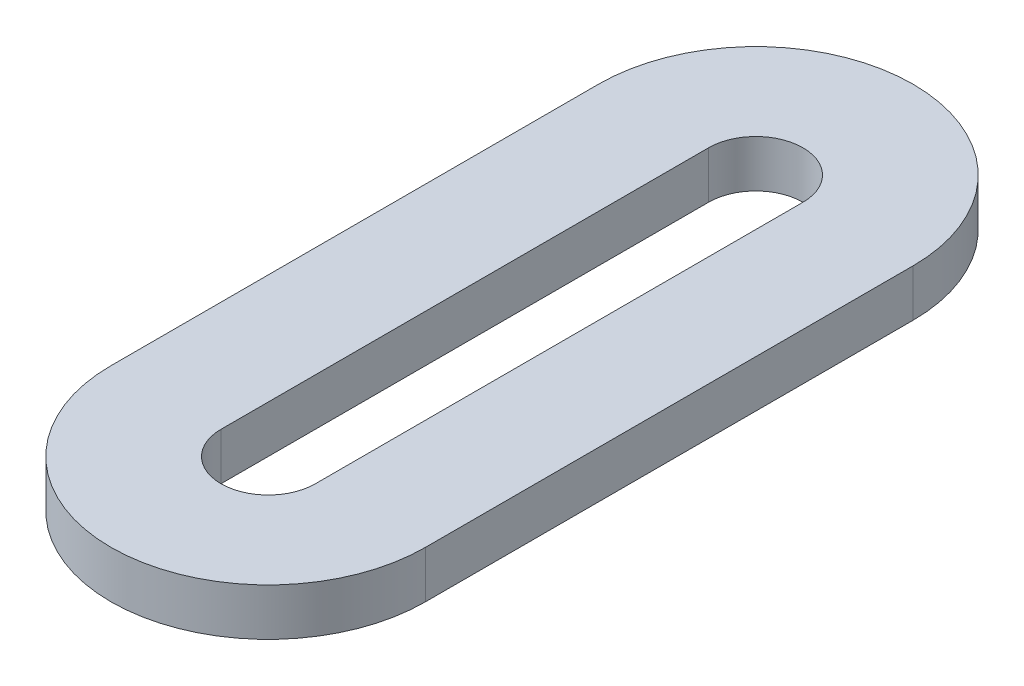
ISO-10303-21;
HEADER;
FILE_DESCRIPTION(('STEP AP214'),'2;1');
FILE_NAME('part.step','',(''),(''),'','','');
FILE_SCHEMA(('AUTOMOTIVE_DESIGN { 1 0 10303 214 1 1 1 1 }'));
ENDSEC;
DATA;
#1=APPLICATION_CONTEXT('core data for automotive mechanical design processes');
#2=APPLICATION_PROTOCOL_DEFINITION('international standard','automotive_design',2000,#1);
#3=PRODUCT_CONTEXT('',#1,'mechanical');
#4=PRODUCT('Part','Part','',(#3));
#5=PRODUCT_RELATED_PRODUCT_CATEGORY('part','',(#4));
#6=PRODUCT_DEFINITION_FORMATION('','',#4);
#7=PRODUCT_DEFINITION_CONTEXT('part definition',#1,'design');
#8=PRODUCT_DEFINITION('design','',#6,#7);
#9=PRODUCT_DEFINITION_SHAPE('','',#8);
#10=(LENGTH_UNIT() NAMED_UNIT(*) SI_UNIT(.MILLI.,.METRE.));
#11=(NAMED_UNIT(*) PLANE_ANGLE_UNIT() SI_UNIT($,.RADIAN.));
#12=(NAMED_UNIT(*) SI_UNIT($,.STERADIAN.) SOLID_ANGLE_UNIT());
#13=UNCERTAINTY_MEASURE_WITH_UNIT(LENGTH_MEASURE(1.E-05),#10,'distance_accuracy_value','');
#14=(GEOMETRIC_REPRESENTATION_CONTEXT(3) GLOBAL_UNCERTAINTY_ASSIGNED_CONTEXT((#13)) GLOBAL_UNIT_ASSIGNED_CONTEXT((#10,
#11,#12)) REPRESENTATION_CONTEXT('',''));
#15=CARTESIAN_POINT('',(0.,0.,0.));
#16=DIRECTION('',(0.,0.,1.));
#17=DIRECTION('',(1.,0.,0.));
#18=AXIS2_PLACEMENT_3D('',#15,#16,#17);
#19=CARTESIAN_POINT('',(0.,3.,-31.));
#20=DIRECTION('',(0.,1.,0.));
#21=DIRECTION('',(0.,0.,1.));
#22=AXIS2_PLACEMENT_3D('',#19,#20,#21);
#23=PLANE('',#22);
#24=CARTESIAN_POINT('',(0.,3.,-31.));
#25=DIRECTION('',(0.,1.,0.));
#26=DIRECTION('',(0.,0.,1.));
#27=AXIS2_PLACEMENT_3D('',#24,#25,#26);
#28=CIRCLE('',#27,9.99999999999999);
#29=CARTESIAN_POINT('',(9.99999999999999,3.,-31.));
#30=VERTEX_POINT('',#29);
#31=CARTESIAN_POINT('',(-9.99999999999999,3.,-31.));
#32=VERTEX_POINT('',#31);
#33=EDGE_CURVE('E133',#30,#32,#28,.T.);
#34=ORIENTED_EDGE('',*,*,#33,.T.);
#35=DIRECTION('',(0.,0.,1.));
#36=VECTOR('',#35,1.);
#37=CARTESIAN_POINT('',(-9.99999999999999,3.,-31.));
#38=LINE('',#37,#36);
#39=CARTESIAN_POINT('',(-9.99999999999999,3.,0.));
#40=VERTEX_POINT('',#39);
#41=EDGE_CURVE('E136',#32,#40,#38,.T.);
#42=ORIENTED_EDGE('',*,*,#41,.T.);
#43=CARTESIAN_POINT('',(0.,3.,0.));
#44=DIRECTION('',(0.,1.,0.));
#45=DIRECTION('',(0.,0.,1.));
#46=AXIS2_PLACEMENT_3D('',#43,#44,#45);
#47=CIRCLE('',#46,9.99999999999999);
#48=CARTESIAN_POINT('',(9.99999999999999,3.,0.));
#49=VERTEX_POINT('',#48);
#50=EDGE_CURVE('E139',#40,#49,#47,.T.);
#51=ORIENTED_EDGE('',*,*,#50,.T.);
#52=DIRECTION('',(0.,0.,-1.));
#53=VECTOR('',#52,1.);
#54=CARTESIAN_POINT('',(9.99999999999999,3.,-31.));
#55=LINE('',#54,#53);
#56=EDGE_CURVE('E141',#49,#30,#55,.T.);
#57=ORIENTED_EDGE('',*,*,#56,.T.);
#58=EDGE_LOOP('',(#34,#42,#51,#57));
#59=FACE_BOUND('',#58,.T.);
#60=DIRECTION('',(0.,0.,-1.));
#61=VECTOR('',#60,1.);
#62=CARTESIAN_POINT('',(2.99999999999999,3.,0.));
#63=LINE('',#62,#61);
#64=CARTESIAN_POINT('',(2.99999999999999,3.,0.));
#65=VERTEX_POINT('',#64);
#66=CARTESIAN_POINT('',(2.99999999999999,3.,-31.));
#67=VERTEX_POINT('',#66);
#68=EDGE_CURVE('E105',#65,#67,#63,.T.);
#69=ORIENTED_EDGE('',*,*,#68,.F.);
#70=CARTESIAN_POINT('',(0.,3.,0.));
#71=DIRECTION('',(0.,1.,0.));
#72=DIRECTION('',(0.,0.,1.));
#73=AXIS2_PLACEMENT_3D('',#70,#71,#72);
#74=CIRCLE('',#73,2.99999999999999);
#75=CARTESIAN_POINT('',(-2.99999999999999,3.,0.));
#76=VERTEX_POINT('',#75);
#77=EDGE_CURVE('E97',#76,#65,#74,.T.);
#78=ORIENTED_EDGE('',*,*,#77,.F.);
#79=DIRECTION('',(0.,0.,1.));
#80=VECTOR('',#79,1.);
#81=CARTESIAN_POINT('',(-2.99999999999999,3.,0.));
#82=LINE('',#81,#80);
#83=CARTESIAN_POINT('',(-2.99999999999999,3.,-31.));
#84=VERTEX_POINT('',#83);
#85=EDGE_CURVE('E119',#84,#76,#82,.T.);
#86=ORIENTED_EDGE('',*,*,#85,.F.);
#87=CARTESIAN_POINT('',(0.,3.,-31.));
#88=DIRECTION('',(0.,1.,0.));
#89=DIRECTION('',(0.,0.,1.));
#90=AXIS2_PLACEMENT_3D('',#87,#88,#89);
#91=CIRCLE('',#90,2.99999999999999);
#92=EDGE_CURVE('E117',#67,#84,#91,.T.);
#93=ORIENTED_EDGE('',*,*,#92,.F.);
#94=EDGE_LOOP('',(#69,#78,#86,#93));
#95=FACE_BOUND('',#94,.T.);
#96=ADVANCED_FACE('F32',(#59,#95),#23,.T.);
#97=CARTESIAN_POINT('',(0.,0.,-31.));
#98=DIRECTION('',(0.,1.,0.));
#99=DIRECTION('',(0.,0.,1.));
#100=AXIS2_PLACEMENT_3D('',#97,#98,#99);
#101=PLANE('',#100);
#102=CARTESIAN_POINT('',(0.,0.,-31.));
#103=DIRECTION('',(0.,1.,0.));
#104=DIRECTION('',(0.,0.,1.));
#105=AXIS2_PLACEMENT_3D('',#102,#103,#104);
#106=CIRCLE('',#105,9.99999999999999);
#107=CARTESIAN_POINT('',(9.99999999999999,0.,-31.));
#108=VERTEX_POINT('',#107);
#109=CARTESIAN_POINT('',(-9.99999999999999,0.,-31.));
#110=VERTEX_POINT('',#109);
#111=EDGE_CURVE('E113',#108,#110,#106,.T.);
#112=ORIENTED_EDGE('',*,*,#111,.F.);
#113=DIRECTION('',(0.,0.,-1.));
#114=VECTOR('',#113,1.);
#115=CARTESIAN_POINT('',(9.99999999999999,0.,-31.));
#116=LINE('',#115,#114);
#117=CARTESIAN_POINT('',(9.99999999999999,0.,0.));
#118=VERTEX_POINT('',#117);
#119=EDGE_CURVE('E137',#118,#108,#116,.T.);
#120=ORIENTED_EDGE('',*,*,#119,.F.);
#121=CARTESIAN_POINT('',(0.,0.,0.));
#122=DIRECTION('',(0.,1.,0.));
#123=DIRECTION('',(0.,0.,1.));
#124=AXIS2_PLACEMENT_3D('',#121,#122,#123);
#125=CIRCLE('',#124,9.99999999999999);
#126=CARTESIAN_POINT('',(-9.99999999999999,0.,0.));
#127=VERTEX_POINT('',#126);
#128=EDGE_CURVE('E148',#127,#118,#125,.T.);
#129=ORIENTED_EDGE('',*,*,#128,.F.);
#130=DIRECTION('',(0.,0.,1.));
#131=VECTOR('',#130,1.);
#132=CARTESIAN_POINT('',(-9.99999999999999,0.,-31.));
#133=LINE('',#132,#131);
#134=EDGE_CURVE('E146',#110,#127,#133,.T.);
#135=ORIENTED_EDGE('',*,*,#134,.F.);
#136=EDGE_LOOP('',(#112,#120,#129,#135));
#137=FACE_BOUND('',#136,.T.);
#138=CARTESIAN_POINT('',(0.,0.,0.));
#139=DIRECTION('',(0.,1.,0.));
#140=DIRECTION('',(0.,0.,1.));
#141=AXIS2_PLACEMENT_3D('',#138,#139,#140);
#142=CIRCLE('',#141,2.99999999999999);
#143=CARTESIAN_POINT('',(-2.99999999999999,0.,0.));
#144=VERTEX_POINT('',#143);
#145=CARTESIAN_POINT('',(2.99999999999999,0.,0.));
#146=VERTEX_POINT('',#145);
#147=EDGE_CURVE('E55',#144,#146,#142,.T.);
#148=ORIENTED_EDGE('',*,*,#147,.T.);
#149=DIRECTION('',(0.,0.,-1.));
#150=VECTOR('',#149,1.);
#151=CARTESIAN_POINT('',(2.99999999999999,0.,0.));
#152=LINE('',#151,#150);
#153=CARTESIAN_POINT('',(2.99999999999999,0.,-31.));
#154=VERTEX_POINT('',#153);
#155=EDGE_CURVE('E112',#146,#154,#152,.T.);
#156=ORIENTED_EDGE('',*,*,#155,.T.);
#157=CARTESIAN_POINT('',(0.,0.,-31.));
#158=DIRECTION('',(0.,1.,0.));
#159=DIRECTION('',(0.,0.,1.));
#160=AXIS2_PLACEMENT_3D('',#157,#158,#159);
#161=CIRCLE('',#160,2.99999999999999);
#162=CARTESIAN_POINT('',(-2.99999999999999,0.,-31.));
#163=VERTEX_POINT('',#162);
#164=EDGE_CURVE('E125',#154,#163,#161,.T.);
#165=ORIENTED_EDGE('',*,*,#164,.T.);
#166=DIRECTION('',(0.,0.,1.));
#167=VECTOR('',#166,1.);
#168=CARTESIAN_POINT('',(-2.99999999999999,0.,0.));
#169=LINE('',#168,#167);
#170=EDGE_CURVE('E106',#163,#144,#169,.T.);
#171=ORIENTED_EDGE('',*,*,#170,.T.);
#172=EDGE_LOOP('',(#148,#156,#165,#171));
#173=FACE_BOUND('',#172,.T.);
#174=ADVANCED_FACE('F166',(#137,#173),#101,.F.);
#175=CARTESIAN_POINT('',(0.,3.,-31.));
#176=DIRECTION('',(0.,-1.,0.));
#177=DIRECTION('',(0.,0.,-1.));
#178=AXIS2_PLACEMENT_3D('',#175,#176,#177);
#179=CYLINDRICAL_SURFACE('',#178,9.99999999999999);
#180=ORIENTED_EDGE('',*,*,#111,.T.);
#181=DIRECTION('',(0.,-1.,0.));
#182=VECTOR('',#181,1.);
#183=CARTESIAN_POINT('',(-9.99999999999999,3.,-31.));
#184=LINE('',#183,#182);
#185=EDGE_CURVE('E11',#32,#110,#184,.T.);
#186=ORIENTED_EDGE('',*,*,#185,.F.);
#187=ORIENTED_EDGE('',*,*,#33,.F.);
#188=DIRECTION('',(0.,-1.,0.));
#189=VECTOR('',#188,1.);
#190=CARTESIAN_POINT('',(9.99999999999999,3.,-31.));
#191=LINE('',#190,#189);
#192=EDGE_CURVE('E143',#30,#108,#191,.T.);
#193=ORIENTED_EDGE('',*,*,#192,.T.);
#194=EDGE_LOOP('',(#180,#186,#187,#193));
#195=FACE_BOUND('',#194,.T.);
#196=ADVANCED_FACE('F34',(#195),#179,.T.);
#197=CARTESIAN_POINT('',(-9.99999999999999,3.,-31.));
#198=DIRECTION('',(1.,0.,0.));
#199=DIRECTION('',(0.,0.,-1.));
#200=AXIS2_PLACEMENT_3D('',#197,#198,#199);
#201=PLANE('',#200);
#202=ORIENTED_EDGE('',*,*,#134,.T.);
#203=DIRECTION('',(0.,-1.,0.));
#204=VECTOR('',#203,1.);
#205=CARTESIAN_POINT('',(-9.99999999999999,3.,0.));
#206=LINE('',#205,#204);
#207=EDGE_CURVE('E40',#40,#127,#206,.T.);
#208=ORIENTED_EDGE('',*,*,#207,.F.);
#209=ORIENTED_EDGE('',*,*,#41,.F.);
#210=ORIENTED_EDGE('',*,*,#185,.T.);
#211=EDGE_LOOP('',(#202,#208,#209,#210));
#212=FACE_BOUND('',#211,.T.);
#213=ADVANCED_FACE('F176',(#212),#201,.F.);
#214=CARTESIAN_POINT('',(0.,3.,0.));
#215=DIRECTION('',(0.,-1.,0.));
#216=DIRECTION('',(0.,0.,-1.));
#217=AXIS2_PLACEMENT_3D('',#214,#215,#216);
#218=CYLINDRICAL_SURFACE('',#217,9.99999999999999);
#219=ORIENTED_EDGE('',*,*,#128,.T.);
#220=DIRECTION('',(0.,-1.,0.));
#221=VECTOR('',#220,1.);
#222=CARTESIAN_POINT('',(9.99999999999999,3.,0.));
#223=LINE('',#222,#221);
#224=EDGE_CURVE('E153',#49,#118,#223,.T.);
#225=ORIENTED_EDGE('',*,*,#224,.F.);
#226=ORIENTED_EDGE('',*,*,#50,.F.);
#227=ORIENTED_EDGE('',*,*,#207,.T.);
#228=EDGE_LOOP('',(#219,#225,#226,#227));
#229=FACE_BOUND('',#228,.T.);
#230=ADVANCED_FACE('F160',(#229),#218,.T.);
#231=CARTESIAN_POINT('',(9.99999999999999,3.,-31.));
#232=DIRECTION('',(-1.,0.,0.));
#233=DIRECTION('',(0.,0.,1.));
#234=AXIS2_PLACEMENT_3D('',#231,#232,#233);
#235=PLANE('',#234);
#236=ORIENTED_EDGE('',*,*,#119,.T.);
#237=ORIENTED_EDGE('',*,*,#192,.F.);
#238=ORIENTED_EDGE('',*,*,#56,.F.);
#239=ORIENTED_EDGE('',*,*,#224,.T.);
#240=EDGE_LOOP('',(#236,#237,#238,#239));
#241=FACE_BOUND('',#240,.T.);
#242=ADVANCED_FACE('F170',(#241),#235,.F.);
#243=CARTESIAN_POINT('',(0.,3.,0.));
#244=DIRECTION('',(0.,-1.,0.));
#245=DIRECTION('',(0.,0.,-1.));
#246=AXIS2_PLACEMENT_3D('',#243,#244,#245);
#247=CYLINDRICAL_SURFACE('',#246,2.99999999999999);
#248=ORIENTED_EDGE('',*,*,#147,.F.);
#249=DIRECTION('',(0.,-1.,0.));
#250=VECTOR('',#249,1.);
#251=CARTESIAN_POINT('',(-2.99999999999999,3.,0.));
#252=LINE('',#251,#250);
#253=EDGE_CURVE('E101',#76,#144,#252,.T.);
#254=ORIENTED_EDGE('',*,*,#253,.F.);
#255=ORIENTED_EDGE('',*,*,#77,.T.);
#256=DIRECTION('',(0.,-1.,0.));
#257=VECTOR('',#256,1.);
#258=CARTESIAN_POINT('',(2.99999999999999,3.,0.));
#259=LINE('',#258,#257);
#260=EDGE_CURVE('E100',#65,#146,#259,.T.);
#261=ORIENTED_EDGE('',*,*,#260,.T.);
#262=EDGE_LOOP('',(#248,#254,#255,#261));
#263=FACE_BOUND('',#262,.T.);
#264=ADVANCED_FACE('F99',(#263),#247,.F.);
#265=CARTESIAN_POINT('',(2.99999999999999,3.,0.));
#266=DIRECTION('',(-1.,0.,0.));
#267=DIRECTION('',(0.,0.,1.));
#268=AXIS2_PLACEMENT_3D('',#265,#266,#267);
#269=PLANE('',#268);
#270=ORIENTED_EDGE('',*,*,#155,.F.);
#271=ORIENTED_EDGE('',*,*,#260,.F.);
#272=ORIENTED_EDGE('',*,*,#68,.T.);
#273=DIRECTION('',(0.,-1.,0.));
#274=VECTOR('',#273,1.);
#275=CARTESIAN_POINT('',(2.99999999999999,3.,-31.));
#276=LINE('',#275,#274);
#277=EDGE_CURVE('E114',#67,#154,#276,.T.);
#278=ORIENTED_EDGE('',*,*,#277,.T.);
#279=EDGE_LOOP('',(#270,#271,#272,#278));
#280=FACE_BOUND('',#279,.T.);
#281=ADVANCED_FACE('F109',(#280),#269,.T.);
#282=CARTESIAN_POINT('',(0.,3.,-31.));
#283=DIRECTION('',(0.,-1.,0.));
#284=DIRECTION('',(0.,0.,-1.));
#285=AXIS2_PLACEMENT_3D('',#282,#283,#284);
#286=CYLINDRICAL_SURFACE('',#285,2.99999999999999);
#287=ORIENTED_EDGE('',*,*,#164,.F.);
#288=ORIENTED_EDGE('',*,*,#277,.F.);
#289=ORIENTED_EDGE('',*,*,#92,.T.);
#290=DIRECTION('',(0.,-1.,0.));
#291=VECTOR('',#290,1.);
#292=CARTESIAN_POINT('',(-2.99999999999999,3.,-31.));
#293=LINE('',#292,#291);
#294=EDGE_CURVE('E47',#84,#163,#293,.T.);
#295=ORIENTED_EDGE('',*,*,#294,.T.);
#296=EDGE_LOOP('',(#287,#288,#289,#295));
#297=FACE_BOUND('',#296,.T.);
#298=ADVANCED_FACE('F199',(#297),#286,.F.);
#299=CARTESIAN_POINT('',(-2.99999999999999,3.,0.));
#300=DIRECTION('',(1.,0.,0.));
#301=DIRECTION('',(0.,0.,-1.));
#302=AXIS2_PLACEMENT_3D('',#299,#300,#301);
#303=PLANE('',#302);
#304=ORIENTED_EDGE('',*,*,#170,.F.);
#305=ORIENTED_EDGE('',*,*,#294,.F.);
#306=ORIENTED_EDGE('',*,*,#85,.T.);
#307=ORIENTED_EDGE('',*,*,#253,.T.);
#308=EDGE_LOOP('',(#304,#305,#306,#307));
#309=FACE_BOUND('',#308,.T.);
#310=ADVANCED_FACE('F203',(#309),#303,.T.);
#311=CLOSED_SHELL('',(#96,#174,#196,#213,#230,#242,#264,#281,#298,#310));
#312=MANIFOLD_SOLID_BREP('B2',#311);
#313=ADVANCED_BREP_SHAPE_REPRESENTATION('',(#18,#312),#14);
#314=SHAPE_DEFINITION_REPRESENTATION(#9,#313);
ENDSEC;
END-ISO-10303-21;
